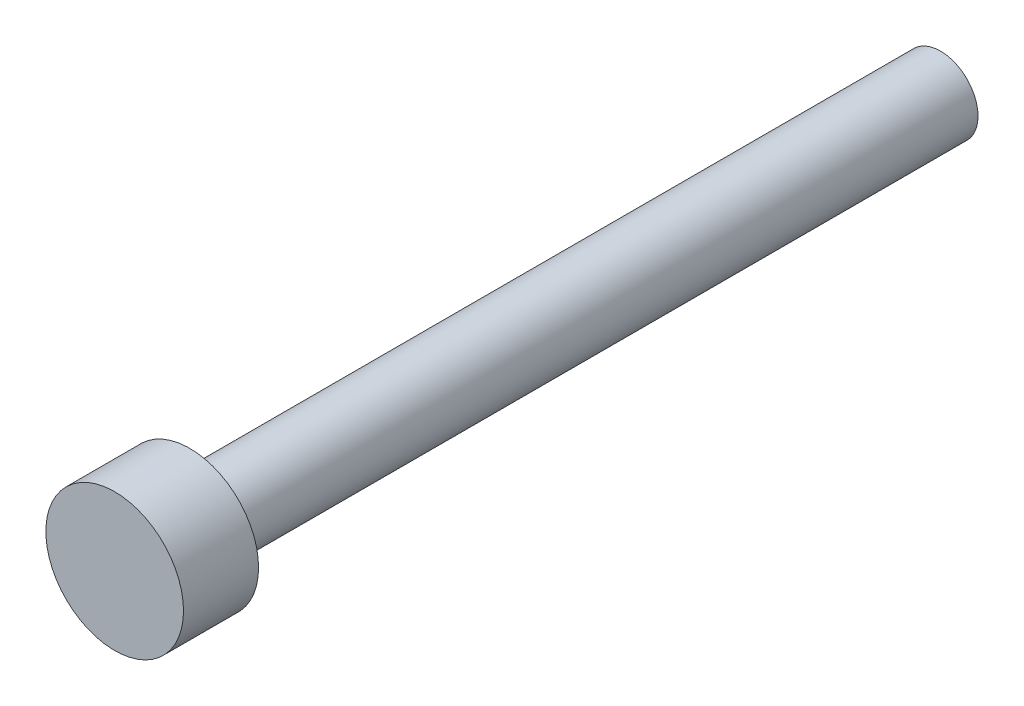
ISO-10303-21;
HEADER;
FILE_DESCRIPTION(('STEP AP214'),'2;1');
FILE_NAME('part.step','',(''),(''),'','','');
FILE_SCHEMA(('AUTOMOTIVE_DESIGN { 1 0 10303 214 1 1 1 1 }'));
ENDSEC;
DATA;
#1=APPLICATION_CONTEXT('core data for automotive mechanical design processes');
#2=APPLICATION_PROTOCOL_DEFINITION('international standard','automotive_design',2000,#1);
#3=PRODUCT_CONTEXT('',#1,'mechanical');
#4=PRODUCT('Part','Part','',(#3));
#5=PRODUCT_RELATED_PRODUCT_CATEGORY('part','',(#4));
#6=PRODUCT_DEFINITION_FORMATION('','',#4);
#7=PRODUCT_DEFINITION_CONTEXT('part definition',#1,'design');
#8=PRODUCT_DEFINITION('design','',#6,#7);
#9=PRODUCT_DEFINITION_SHAPE('','',#8);
#10=(LENGTH_UNIT() NAMED_UNIT(*) SI_UNIT(.MILLI.,.METRE.));
#11=(NAMED_UNIT(*) PLANE_ANGLE_UNIT() SI_UNIT($,.RADIAN.));
#12=(NAMED_UNIT(*) SI_UNIT($,.STERADIAN.) SOLID_ANGLE_UNIT());
#13=UNCERTAINTY_MEASURE_WITH_UNIT(LENGTH_MEASURE(1.E-05),#10,'distance_accuracy_value','');
#14=(GEOMETRIC_REPRESENTATION_CONTEXT(3) GLOBAL_UNCERTAINTY_ASSIGNED_CONTEXT((#13)) GLOBAL_UNIT_ASSIGNED_CONTEXT((#10,
#11,#12)) REPRESENTATION_CONTEXT('',''));
#15=CARTESIAN_POINT('',(0.,0.,0.));
#16=DIRECTION('',(0.,0.,1.));
#17=DIRECTION('',(1.,0.,0.));
#18=AXIS2_PLACEMENT_3D('',#15,#16,#17);
#19=CARTESIAN_POINT('',(0.,0.,0.));
#20=DIRECTION('',(0.,0.,-1.));
#21=DIRECTION('',(-1.,0.,0.));
#22=AXIS2_PLACEMENT_3D('',#19,#20,#21);
#23=CYLINDRICAL_SURFACE('',#22,1.5);
#24=CARTESIAN_POINT('',(0.,0.,0.));
#25=DIRECTION('',(0.,0.,1.));
#26=DIRECTION('',(1.,0.,0.));
#27=AXIS2_PLACEMENT_3D('',#24,#25,#26);
#28=CIRCLE('',#27,1.5);
#29=CARTESIAN_POINT('',(1.5,0.,0.));
#30=VERTEX_POINT('',#29);
#31=EDGE_CURVE('E10',#30,#30,#28,.T.);
#32=ORIENTED_EDGE('',*,*,#31,.F.);
#33=EDGE_LOOP('',(#32));
#34=FACE_BOUND('',#33,.T.);
#35=CARTESIAN_POINT('',(0.,0.,-30.));
#36=DIRECTION('',(0.,0.,1.));
#37=DIRECTION('',(1.,0.,0.));
#38=AXIS2_PLACEMENT_3D('',#35,#36,#37);
#39=CIRCLE('',#38,1.5);
#40=CARTESIAN_POINT('',(1.5,0.,-30.));
#41=VERTEX_POINT('',#40);
#42=EDGE_CURVE('E37',#41,#41,#39,.T.);
#43=ORIENTED_EDGE('',*,*,#42,.T.);
#44=EDGE_LOOP('',(#43));
#45=FACE_BOUND('',#44,.T.);
#46=ADVANCED_FACE('F40',(#34,#45),#23,.T.);
#47=CARTESIAN_POINT('',(0.,0.,-30.));
#48=DIRECTION('',(0.,0.,1.));
#49=DIRECTION('',(1.,0.,0.));
#50=AXIS2_PLACEMENT_3D('',#47,#48,#49);
#51=PLANE('',#50);
#52=ORIENTED_EDGE('',*,*,#42,.F.);
#53=EDGE_LOOP('',(#52));
#54=FACE_BOUND('',#53,.T.);
#55=ADVANCED_FACE('F58',(#54),#51,.F.);
#56=CARTESIAN_POINT('',(0.,0.,3.));
#57=DIRECTION('',(0.,0.,-1.));
#58=DIRECTION('',(-1.,0.,0.));
#59=AXIS2_PLACEMENT_3D('',#56,#57,#58);
#60=CYLINDRICAL_SURFACE('',#59,2.75);
#61=CARTESIAN_POINT('',(0.,0.,3.));
#62=DIRECTION('',(0.,0.,1.));
#63=DIRECTION('',(1.,0.,0.));
#64=AXIS2_PLACEMENT_3D('',#61,#62,#63);
#65=CIRCLE('',#64,2.75);
#66=CARTESIAN_POINT('',(2.75,0.,3.));
#67=VERTEX_POINT('',#66);
#68=EDGE_CURVE('E50',#67,#67,#65,.T.);
#69=ORIENTED_EDGE('',*,*,#68,.F.);
#70=EDGE_LOOP('',(#69));
#71=FACE_BOUND('',#70,.T.);
#72=CARTESIAN_POINT('',(0.,0.,0.));
#73=DIRECTION('',(0.,0.,1.));
#74=DIRECTION('',(1.,0.,0.));
#75=AXIS2_PLACEMENT_3D('',#72,#73,#74);
#76=CIRCLE('',#75,2.75);
#77=CARTESIAN_POINT('',(2.75,0.,0.));
#78=VERTEX_POINT('',#77);
#79=EDGE_CURVE('E47',#78,#78,#76,.T.);
#80=ORIENTED_EDGE('',*,*,#79,.T.);
#81=EDGE_LOOP('',(#80));
#82=FACE_BOUND('',#81,.T.);
#83=ADVANCED_FACE('F60',(#71,#82),#60,.T.);
#84=CARTESIAN_POINT('',(0.,0.,3.));
#85=DIRECTION('',(0.,0.,1.));
#86=DIRECTION('',(1.,0.,0.));
#87=AXIS2_PLACEMENT_3D('',#84,#85,#86);
#88=PLANE('',#87);
#89=ORIENTED_EDGE('',*,*,#68,.T.);
#90=EDGE_LOOP('',(#89));
#91=FACE_BOUND('',#90,.T.);
#92=ADVANCED_FACE('F54',(#91),#88,.T.);
#93=CARTESIAN_POINT('',(0.,0.,0.));
#94=DIRECTION('',(0.,0.,1.));
#95=DIRECTION('',(1.,0.,0.));
#96=AXIS2_PLACEMENT_3D('',#93,#94,#95);
#97=PLANE('',#96);
#98=ORIENTED_EDGE('',*,*,#31,.T.);
#99=EDGE_LOOP('',(#98));
#100=FACE_BOUND('',#99,.T.);
#101=ORIENTED_EDGE('',*,*,#79,.F.);
#102=EDGE_LOOP('',(#101));
#103=FACE_BOUND('',#102,.T.);
#104=ADVANCED_FACE('F61',(#100,#103),#97,.F.);
#105=CLOSED_SHELL('',(#46,#55,#83,#92,#104));
#106=MANIFOLD_SOLID_BREP('B2',#105);
#107=ADVANCED_BREP_SHAPE_REPRESENTATION('',(#18,#106),#14);
#108=SHAPE_DEFINITION_REPRESENTATION(#9,#107);
ENDSEC;
END-ISO-10303-21;
